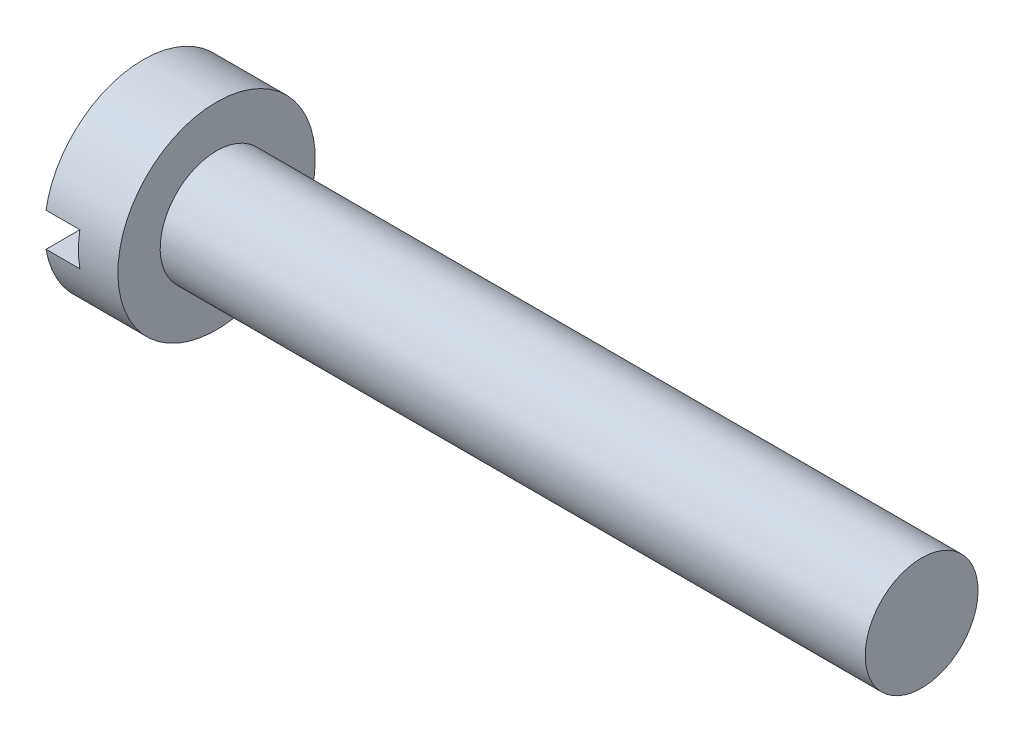
ISO-10303-21;
HEADER;
FILE_DESCRIPTION(('STEP AP214'),'2;1');
FILE_NAME('part.step','',(''),(''),'','','');
FILE_SCHEMA(('AUTOMOTIVE_DESIGN { 1 0 10303 214 1 1 1 1 }'));
ENDSEC;
DATA;
#1=APPLICATION_CONTEXT('core data for automotive mechanical design processes');
#2=APPLICATION_PROTOCOL_DEFINITION('international standard','automotive_design',2000,#1);
#3=PRODUCT_CONTEXT('',#1,'mechanical');
#4=PRODUCT('Part','Part','',(#3));
#5=PRODUCT_RELATED_PRODUCT_CATEGORY('part','',(#4));
#6=PRODUCT_DEFINITION_FORMATION('','',#4);
#7=PRODUCT_DEFINITION_CONTEXT('part definition',#1,'design');
#8=PRODUCT_DEFINITION('design','',#6,#7);
#9=PRODUCT_DEFINITION_SHAPE('','',#8);
#10=(LENGTH_UNIT() NAMED_UNIT(*) SI_UNIT(.MILLI.,.METRE.));
#11=(NAMED_UNIT(*) PLANE_ANGLE_UNIT() SI_UNIT($,.RADIAN.));
#12=(NAMED_UNIT(*) SI_UNIT($,.STERADIAN.) SOLID_ANGLE_UNIT());
#13=UNCERTAINTY_MEASURE_WITH_UNIT(LENGTH_MEASURE(1.E-05),#10,'distance_accuracy_value','');
#14=(GEOMETRIC_REPRESENTATION_CONTEXT(3) GLOBAL_UNCERTAINTY_ASSIGNED_CONTEXT((#13)) GLOBAL_UNIT_ASSIGNED_CONTEXT((#10,
#11,#12)) REPRESENTATION_CONTEXT('',''));
#15=CARTESIAN_POINT('',(0.,0.,0.));
#16=DIRECTION('',(0.,0.,1.));
#17=DIRECTION('',(1.,0.,0.));
#18=AXIS2_PLACEMENT_3D('',#15,#16,#17);
#19=CARTESIAN_POINT('',(0.,0.,0.));
#20=DIRECTION('',(-1.,0.,0.));
#21=DIRECTION('',(0.,-1.,0.));
#22=AXIS2_PLACEMENT_3D('',#19,#20,#21);
#23=PLANE('',#22);
#24=DIRECTION('',(0.,0.,-1.));
#25=VECTOR('',#24,1.);
#26=CARTESIAN_POINT('',(0.,0.599999999999996,-3.5));
#27=LINE('',#26,#25);
#28=CARTESIAN_POINT('',(0.,0.599999999999999,3.44818792991333));
#29=VERTEX_POINT('',#28);
#30=CARTESIAN_POINT('',(0.,0.599999999999996,-3.44818792991333));
#31=VERTEX_POINT('',#30);
#32=EDGE_CURVE('E83',#29,#31,#27,.T.);
#33=ORIENTED_EDGE('',*,*,#32,.F.);
#34=CARTESIAN_POINT('',(0.,0.,0.));
#35=DIRECTION('',(1.,0.,0.));
#36=DIRECTION('',(0.,1.,0.));
#37=AXIS2_PLACEMENT_3D('',#34,#35,#36);
#38=CIRCLE('',#37,3.5);
#39=EDGE_CURVE('E89',#31,#29,#38,.T.);
#40=ORIENTED_EDGE('',*,*,#39,.F.);
#41=EDGE_LOOP('',(#33,#40));
#42=FACE_BOUND('',#41,.T.);
#43=ADVANCED_FACE('F33',(#42),#23,.T.);
#44=DIRECTION('',(0.,0.,1.));
#45=VECTOR('',#44,1.);
#46=CARTESIAN_POINT('',(0.,-0.600000000000001,-3.5));
#47=LINE('',#46,#45);
#48=CARTESIAN_POINT('',(0.,-0.600000000000001,-3.44818792991333));
#49=VERTEX_POINT('',#48);
#50=CARTESIAN_POINT('',(0.,-0.599999999999999,3.44818792991333));
#51=VERTEX_POINT('',#50);
#52=EDGE_CURVE('E77',#49,#51,#47,.T.);
#53=ORIENTED_EDGE('',*,*,#52,.F.);
#54=EDGE_CURVE('E82',#51,#49,#38,.T.);
#55=ORIENTED_EDGE('',*,*,#54,.F.);
#56=EDGE_LOOP('',(#53,#55));
#57=FACE_BOUND('',#56,.T.);
#58=ADVANCED_FACE('F35',(#57),#23,.T.);
#59=CARTESIAN_POINT('',(27.6,0.,0.));
#60=DIRECTION('',(1.,0.,0.));
#61=DIRECTION('',(0.,1.,0.));
#62=AXIS2_PLACEMENT_3D('',#59,#60,#61);
#63=CYLINDRICAL_SURFACE('',#62,3.5);
#64=DIRECTION('',(1.,0.,0.));
#65=VECTOR('',#64,1.);
#66=CARTESIAN_POINT('',(27.6,0.599999999999996,-3.44818792991333));
#67=LINE('',#66,#65);
#68=CARTESIAN_POINT('',(1.2,0.599999999999996,-3.44818792991333));
#69=VERTEX_POINT('',#68);
#70=EDGE_CURVE('E11',#31,#69,#67,.T.);
#71=ORIENTED_EDGE('',*,*,#70,.F.);
#72=ORIENTED_EDGE('',*,*,#39,.T.);
#73=DIRECTION('',(1.,0.,0.));
#74=VECTOR('',#73,1.);
#75=CARTESIAN_POINT('',(27.6,0.599999999999999,3.44818792991333));
#76=LINE('',#75,#74);
#77=CARTESIAN_POINT('',(1.2,0.599999999999999,3.44818792991333));
#78=VERTEX_POINT('',#77);
#79=EDGE_CURVE('E98',#78,#29,#76,.F.);
#80=ORIENTED_EDGE('',*,*,#79,.F.);
#81=CARTESIAN_POINT('',(1.2,0.,0.));
#82=DIRECTION('',(-1.,0.,0.));
#83=DIRECTION('',(0.,0.,1.));
#84=AXIS2_PLACEMENT_3D('',#81,#82,#83);
#85=CIRCLE('',#84,3.5);
#86=CARTESIAN_POINT('',(1.2,-0.599999999999999,3.44818792991333));
#87=VERTEX_POINT('',#86);
#88=EDGE_CURVE('E48',#78,#87,#85,.F.);
#89=ORIENTED_EDGE('',*,*,#88,.T.);
#90=DIRECTION('',(1.,0.,0.));
#91=VECTOR('',#90,1.);
#92=CARTESIAN_POINT('',(27.6,-0.599999999999999,3.44818792991333));
#93=LINE('',#92,#91);
#94=EDGE_CURVE('E88',#51,#87,#93,.T.);
#95=ORIENTED_EDGE('',*,*,#94,.F.);
#96=ORIENTED_EDGE('',*,*,#54,.T.);
#97=DIRECTION('',(1.,0.,0.));
#98=VECTOR('',#97,1.);
#99=CARTESIAN_POINT('',(27.6,-0.600000000000001,-3.44818792991333));
#100=LINE('',#99,#98);
#101=CARTESIAN_POINT('',(1.2,-0.600000000000001,-3.44818792991333));
#102=VERTEX_POINT('',#101);
#103=EDGE_CURVE('E41',#102,#49,#100,.F.);
#104=ORIENTED_EDGE('',*,*,#103,.F.);
#105=EDGE_CURVE('E56',#102,#69,#85,.F.);
#106=ORIENTED_EDGE('',*,*,#105,.T.);
#107=EDGE_LOOP('',(#71,#72,#80,#89,#95,#96,#104,#106));
#108=FACE_BOUND('',#107,.T.);
#109=CARTESIAN_POINT('',(2.6,0.,0.));
#110=DIRECTION('',(1.,0.,0.));
#111=DIRECTION('',(0.,1.,0.));
#112=AXIS2_PLACEMENT_3D('',#109,#110,#111);
#113=CIRCLE('',#112,3.5);
#114=CARTESIAN_POINT('',(2.6,3.5,0.));
#115=VERTEX_POINT('',#114);
#116=EDGE_CURVE('E93',#115,#115,#113,.T.);
#117=ORIENTED_EDGE('',*,*,#116,.F.);
#118=EDGE_LOOP('',(#117));
#119=FACE_BOUND('',#118,.T.);
#120=ADVANCED_FACE('F86',(#108,#119),#63,.T.);
#121=CARTESIAN_POINT('',(2.6,3.5,0.));
#122=DIRECTION('',(1.,0.,0.));
#123=DIRECTION('',(0.,1.,0.));
#124=AXIS2_PLACEMENT_3D('',#121,#122,#123);
#125=PLANE('',#124);
#126=ORIENTED_EDGE('',*,*,#116,.T.);
#127=EDGE_LOOP('',(#126));
#128=FACE_BOUND('',#127,.T.);
#129=CARTESIAN_POINT('',(2.6,0.,0.));
#130=DIRECTION('',(1.,0.,0.));
#131=DIRECTION('',(0.,1.,0.));
#132=AXIS2_PLACEMENT_3D('',#129,#130,#131);
#133=CIRCLE('',#132,2.);
#134=CARTESIAN_POINT('',(2.6,2.,0.));
#135=VERTEX_POINT('',#134);
#136=EDGE_CURVE('E111',#135,#135,#133,.T.);
#137=ORIENTED_EDGE('',*,*,#136,.F.);
#138=EDGE_LOOP('',(#137));
#139=FACE_BOUND('',#138,.T.);
#140=ADVANCED_FACE('F118',(#128,#139),#125,.T.);
#141=CARTESIAN_POINT('',(27.6,0.,0.));
#142=DIRECTION('',(1.,0.,0.));
#143=DIRECTION('',(0.,1.,0.));
#144=AXIS2_PLACEMENT_3D('',#141,#142,#143);
#145=CYLINDRICAL_SURFACE('',#144,2.);
#146=ORIENTED_EDGE('',*,*,#136,.T.);
#147=EDGE_LOOP('',(#146));
#148=FACE_BOUND('',#147,.T.);
#149=CARTESIAN_POINT('',(27.6,0.,0.));
#150=DIRECTION('',(1.,0.,0.));
#151=DIRECTION('',(0.,1.,0.));
#152=AXIS2_PLACEMENT_3D('',#149,#150,#151);
#153=CIRCLE('',#152,1.99999999999999);
#154=CARTESIAN_POINT('',(27.6,2.,0.));
#155=VERTEX_POINT('',#154);
#156=EDGE_CURVE('E109',#155,#155,#153,.T.);
#157=ORIENTED_EDGE('',*,*,#156,.F.);
#158=EDGE_LOOP('',(#157));
#159=FACE_BOUND('',#158,.T.);
#160=ADVANCED_FACE('F125',(#148,#159),#145,.T.);
#161=CARTESIAN_POINT('',(27.6,2.,0.));
#162=DIRECTION('',(1.,0.,0.));
#163=DIRECTION('',(0.,1.,0.));
#164=AXIS2_PLACEMENT_3D('',#161,#162,#163);
#165=PLANE('',#164);
#166=ORIENTED_EDGE('',*,*,#156,.T.);
#167=EDGE_LOOP('',(#166));
#168=FACE_BOUND('',#167,.T.);
#169=ADVANCED_FACE('F150',(#168),#165,.T.);
#170=CARTESIAN_POINT('',(1.2,0.599999999999996,-3.5));
#171=DIRECTION('',(0.,1.,0.));
#172=DIRECTION('',(0.,0.,1.));
#173=AXIS2_PLACEMENT_3D('',#170,#171,#172);
#174=PLANE('',#173);
#175=ORIENTED_EDGE('',*,*,#79,.T.);
#176=ORIENTED_EDGE('',*,*,#32,.T.);
#177=ORIENTED_EDGE('',*,*,#70,.T.);
#178=DIRECTION('',(0.,0.,-1.));
#179=VECTOR('',#178,1.);
#180=CARTESIAN_POINT('',(1.2,0.599999999999996,-3.5));
#181=LINE('',#180,#179);
#182=EDGE_CURVE('E105',#78,#69,#181,.T.);
#183=ORIENTED_EDGE('',*,*,#182,.F.);
#184=EDGE_LOOP('',(#175,#176,#177,#183));
#185=FACE_BOUND('',#184,.T.);
#186=ADVANCED_FACE('F145',(#185),#174,.F.);
#187=CARTESIAN_POINT('',(1.2,-0.600000000000001,-3.5));
#188=DIRECTION('',(0.,-1.,0.));
#189=DIRECTION('',(0.,0.,-1.));
#190=AXIS2_PLACEMENT_3D('',#187,#188,#189);
#191=PLANE('',#190);
#192=ORIENTED_EDGE('',*,*,#103,.T.);
#193=ORIENTED_EDGE('',*,*,#52,.T.);
#194=ORIENTED_EDGE('',*,*,#94,.T.);
#195=DIRECTION('',(0.,0.,1.));
#196=VECTOR('',#195,1.);
#197=CARTESIAN_POINT('',(1.2,-0.600000000000001,-3.5));
#198=LINE('',#197,#196);
#199=EDGE_CURVE('E78',#102,#87,#198,.T.);
#200=ORIENTED_EDGE('',*,*,#199,.F.);
#201=EDGE_LOOP('',(#192,#193,#194,#200));
#202=FACE_BOUND('',#201,.T.);
#203=ADVANCED_FACE('F76',(#202),#191,.F.);
#204=CARTESIAN_POINT('',(1.2,0.,0.));
#205=DIRECTION('',(-1.,0.,0.));
#206=DIRECTION('',(0.,0.,1.));
#207=AXIS2_PLACEMENT_3D('',#204,#205,#206);
#208=PLANE('',#207);
#209=ORIENTED_EDGE('',*,*,#199,.T.);
#210=ORIENTED_EDGE('',*,*,#88,.F.);
#211=ORIENTED_EDGE('',*,*,#182,.T.);
#212=ORIENTED_EDGE('',*,*,#105,.F.);
#213=EDGE_LOOP('',(#209,#210,#211,#212));
#214=FACE_BOUND('',#213,.T.);
#215=ADVANCED_FACE('F160',(#214),#208,.T.);
#216=CLOSED_SHELL('',(#43,#58,#120,#140,#160,#169,#186,#203,#215));
#217=MANIFOLD_SOLID_BREP('B2',#216);
#218=ADVANCED_BREP_SHAPE_REPRESENTATION('',(#18,#217),#14);
#219=SHAPE_DEFINITION_REPRESENTATION(#9,#218);
ENDSEC;
END-ISO-10303-21;
